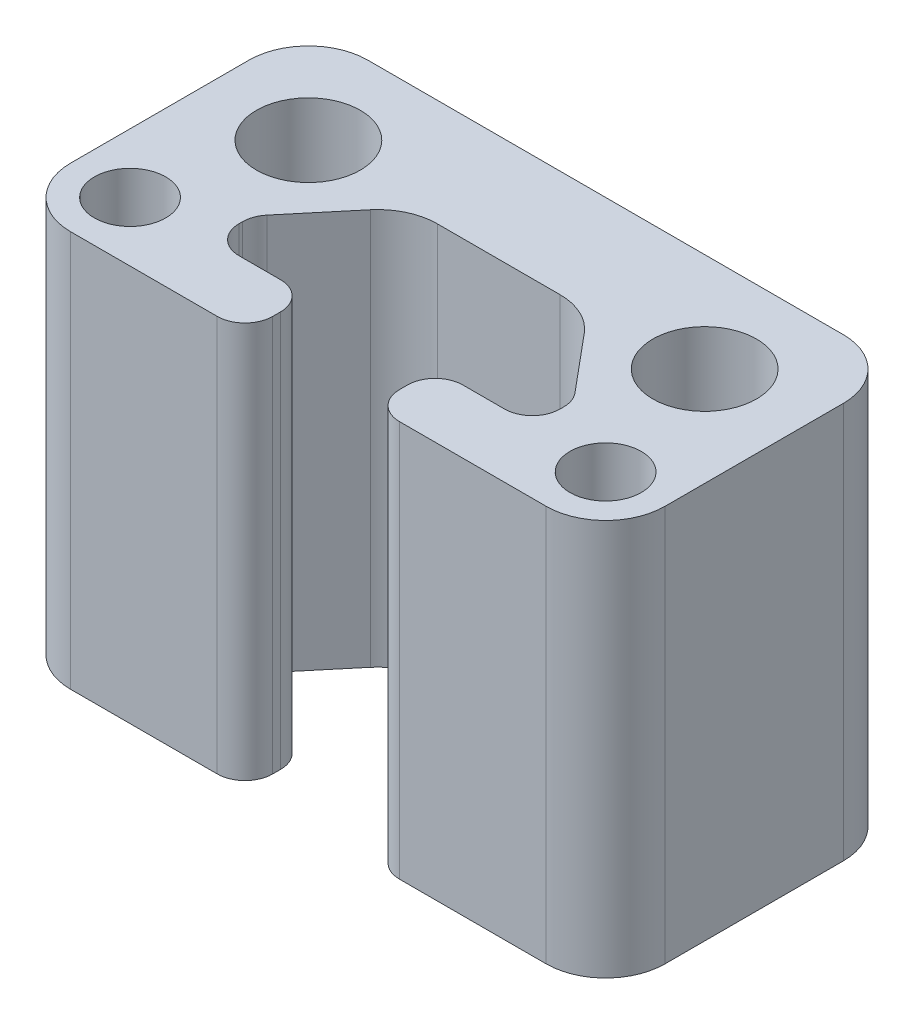
ISO-10303-21;
HEADER;
FILE_DESCRIPTION(('STEP AP214'),'2;1');
FILE_NAME('part.step','',(''),(''),'','','');
FILE_SCHEMA(('AUTOMOTIVE_DESIGN { 1 0 10303 214 1 1 1 1 }'));
ENDSEC;
DATA;
#1=APPLICATION_CONTEXT('core data for automotive mechanical design processes');
#2=APPLICATION_PROTOCOL_DEFINITION('international standard','automotive_design',2000,#1);
#3=PRODUCT_CONTEXT('',#1,'mechanical');
#4=PRODUCT('Part','Part','',(#3));
#5=PRODUCT_RELATED_PRODUCT_CATEGORY('part','',(#4));
#6=PRODUCT_DEFINITION_FORMATION('','',#4);
#7=PRODUCT_DEFINITION_CONTEXT('part definition',#1,'design');
#8=PRODUCT_DEFINITION('design','',#6,#7);
#9=PRODUCT_DEFINITION_SHAPE('','',#8);
#10=(LENGTH_UNIT() NAMED_UNIT(*) SI_UNIT(.MILLI.,.METRE.));
#11=(NAMED_UNIT(*) PLANE_ANGLE_UNIT() SI_UNIT($,.RADIAN.));
#12=(NAMED_UNIT(*) SI_UNIT($,.STERADIAN.) SOLID_ANGLE_UNIT());
#13=UNCERTAINTY_MEASURE_WITH_UNIT(LENGTH_MEASURE(1.E-05),#10,'distance_accuracy_value','');
#14=(GEOMETRIC_REPRESENTATION_CONTEXT(3) GLOBAL_UNCERTAINTY_ASSIGNED_CONTEXT((#13)) GLOBAL_UNIT_ASSIGNED_CONTEXT((#10,
#11,#12)) REPRESENTATION_CONTEXT('',''));
#15=CARTESIAN_POINT('',(0.,0.,0.));
#16=DIRECTION('',(0.,0.,1.));
#17=DIRECTION('',(1.,0.,0.));
#18=AXIS2_PLACEMENT_3D('',#15,#16,#17);
#19=CARTESIAN_POINT('',(34.036,-0.508,131.631514102536));
#20=DIRECTION('',(1.,0.,0.));
#21=DIRECTION('',(0.,0.,-1.));
#22=AXIS2_PLACEMENT_3D('',#19,#20,#21);
#23=PLANE('',#22);
#24=DIRECTION('',(0.,1.,0.));
#25=VECTOR('',#24,1.);
#26=CARTESIAN_POINT('',(34.036,12.7,131.064));
#27=LINE('',#26,#25);
#28=CARTESIAN_POINT('',(34.036,0.,131.064));
#29=VERTEX_POINT('',#28);
#30=CARTESIAN_POINT('',(34.036,25.4,131.064));
#31=VERTEX_POINT('',#30);
#32=EDGE_CURVE('E295',#29,#31,#27,.T.);
#33=ORIENTED_EDGE('',*,*,#32,.T.);
#34=DIRECTION('',(0.,0.,-1.));
#35=VECTOR('',#34,1.);
#36=CARTESIAN_POINT('',(34.036,25.4,123.825));
#37=LINE('',#36,#35);
#38=CARTESIAN_POINT('',(34.036,25.4,131.572));
#39=VERTEX_POINT('',#38);
#40=EDGE_CURVE('E316',#31,#39,#37,.F.);
#41=ORIENTED_EDGE('',*,*,#40,.T.);
#42=DIRECTION('',(0.,-1.,0.));
#43=VECTOR('',#42,1.);
#44=CARTESIAN_POINT('',(34.036,12.7,131.572));
#45=LINE('',#44,#43);
#46=CARTESIAN_POINT('',(34.036,0.,131.572));
#47=VERTEX_POINT('',#46);
#48=EDGE_CURVE('E299',#39,#47,#45,.T.);
#49=ORIENTED_EDGE('',*,*,#48,.T.);
#50=DIRECTION('',(0.,0.,-1.));
#51=VECTOR('',#50,1.);
#52=CARTESIAN_POINT('',(34.036,0.,131.318));
#53=LINE('',#52,#51);
#54=EDGE_CURVE('E453',#29,#47,#53,.F.);
#55=ORIENTED_EDGE('',*,*,#54,.F.);
#56=EDGE_LOOP('',(#33,#41,#49,#55));
#57=FACE_BOUND('',#56,.T.);
#58=ADVANCED_FACE('F17',(#57),#23,.T.);
#59=CARTESIAN_POINT('',(27.813,-0.508,127.567514102536));
#60=DIRECTION('',(1.,0.,0.));
#61=DIRECTION('',(0.,0.,-1.));
#62=AXIS2_PLACEMENT_3D('',#59,#60,#61);
#63=PLANE('',#62);
#64=DIRECTION('',(0.,-1.,0.));
#65=VECTOR('',#64,1.);
#66=CARTESIAN_POINT('',(27.8130000000044,12.7,127.278125725383));
#67=LINE('',#66,#65);
#68=CARTESIAN_POINT('',(27.8130000000022,0.,127.278125725383));
#69=VERTEX_POINT('',#68);
#70=CARTESIAN_POINT('',(27.8130000000022,25.4,127.278125725383));
#71=VERTEX_POINT('',#70);
#72=EDGE_CURVE('E206',#69,#71,#67,.F.);
#73=ORIENTED_EDGE('',*,*,#72,.T.);
#74=DIRECTION('',(0.,0.,-1.));
#75=VECTOR('',#74,1.);
#76=CARTESIAN_POINT('',(27.813,25.4,123.825));
#77=LINE('',#76,#75);
#78=CARTESIAN_POINT('',(27.813,25.4,127.508));
#79=VERTEX_POINT('',#78);
#80=EDGE_CURVE('E319',#71,#79,#77,.F.);
#81=ORIENTED_EDGE('',*,*,#80,.T.);
#82=DIRECTION('',(0.,1.,0.));
#83=VECTOR('',#82,1.);
#84=CARTESIAN_POINT('',(27.813,12.7,127.508));
#85=LINE('',#84,#83);
#86=CARTESIAN_POINT('',(27.813,0.,127.508));
#87=VERTEX_POINT('',#86);
#88=EDGE_CURVE('E406',#79,#87,#85,.F.);
#89=ORIENTED_EDGE('',*,*,#88,.T.);
#90=DIRECTION('',(0.,0.,-1.));
#91=VECTOR('',#90,1.);
#92=CARTESIAN_POINT('',(27.813,0.,127.393062862692));
#93=LINE('',#92,#91);
#94=EDGE_CURVE('E209',#69,#87,#93,.F.);
#95=ORIENTED_EDGE('',*,*,#94,.F.);
#96=EDGE_LOOP('',(#73,#81,#89,#95));
#97=FACE_BOUND('',#96,.T.);
#98=ADVANCED_FACE('F517',(#97),#63,.T.);
#99=CARTESIAN_POINT('',(29.591,0.,127.278125725383));
#100=DIRECTION('',(0.,1.,0.));
#101=DIRECTION('',(0.,0.,1.));
#102=AXIS2_PLACEMENT_3D('',#99,#100,#101);
#103=CYLINDRICAL_SURFACE('',#102,1.77799999999561);
#104=ORIENTED_EDGE('',*,*,#72,.F.);
#105=CARTESIAN_POINT('',(29.591,0.,127.278125725383));
#106=DIRECTION('',(0.,1.,0.));
#107=DIRECTION('',(0.,0.,1.));
#108=AXIS2_PLACEMENT_3D('',#105,#106,#107);
#109=CIRCLE('',#108,1.77799999999561);
#110=CARTESIAN_POINT('',(28.2262260120897,0.,126.138531077296));
#111=VERTEX_POINT('',#110);
#112=EDGE_CURVE('E21',#111,#69,#109,.T.);
#113=ORIENTED_EDGE('',*,*,#112,.F.);
#114=DIRECTION('',(0.,-1.,0.));
#115=VECTOR('',#114,1.);
#116=CARTESIAN_POINT('',(28.2262260120948,12.7,126.13853107729));
#117=LINE('',#116,#115);
#118=CARTESIAN_POINT('',(28.2262260120897,25.4,126.138531077296));
#119=VERTEX_POINT('',#118);
#120=EDGE_CURVE('E205',#111,#119,#117,.F.);
#121=ORIENTED_EDGE('',*,*,#120,.T.);
#122=CARTESIAN_POINT('',(29.591,25.4,127.278125725383));
#123=DIRECTION('',(0.,1.,0.));
#124=DIRECTION('',(0.,0.,1.));
#125=AXIS2_PLACEMENT_3D('',#122,#123,#124);
#126=CIRCLE('',#125,1.77799999999561);
#127=EDGE_CURVE('E317',#119,#71,#126,.T.);
#128=ORIENTED_EDGE('',*,*,#127,.T.);
#129=EDGE_LOOP('',(#104,#113,#121,#128));
#130=FACE_BOUND('',#129,.T.);
#131=ADVANCED_FACE('F203',(#130),#103,.F.);
#132=CARTESIAN_POINT('',(46.609,0.,127.278125725383));
#133=DIRECTION('',(0.,1.,0.));
#134=DIRECTION('',(0.,0.,1.));
#135=AXIS2_PLACEMENT_3D('',#132,#133,#134);
#136=CYLINDRICAL_SURFACE('',#135,1.778);
#137=DIRECTION('',(0.,1.,0.));
#138=VECTOR('',#137,1.);
#139=CARTESIAN_POINT('',(47.9737739879052,12.7,126.13853107729));
#140=LINE('',#139,#138);
#141=CARTESIAN_POINT('',(47.9737739879103,25.4,126.138531077296));
#142=VERTEX_POINT('',#141);
#143=CARTESIAN_POINT('',(47.9737739879103,0.,126.138531077296));
#144=VERTEX_POINT('',#143);
#145=EDGE_CURVE('E397',#142,#144,#140,.F.);
#146=ORIENTED_EDGE('',*,*,#145,.T.);
#147=CARTESIAN_POINT('',(46.609,0.,127.278125725383));
#148=DIRECTION('',(0.,1.,0.));
#149=DIRECTION('',(0.,0.,1.));
#150=AXIS2_PLACEMENT_3D('',#147,#148,#149);
#151=CIRCLE('',#150,1.778);
#152=CARTESIAN_POINT('',(48.387,0.,127.278125725383));
#153=VERTEX_POINT('',#152);
#154=EDGE_CURVE('E322',#153,#144,#151,.T.);
#155=ORIENTED_EDGE('',*,*,#154,.F.);
#156=DIRECTION('',(0.,-1.,0.));
#157=VECTOR('',#156,1.);
#158=CARTESIAN_POINT('',(48.387,12.7,127.278125725383));
#159=LINE('',#158,#157);
#160=CARTESIAN_POINT('',(48.387,25.4,127.278125725383));
#161=VERTEX_POINT('',#160);
#162=EDGE_CURVE('E327',#153,#161,#159,.F.);
#163=ORIENTED_EDGE('',*,*,#162,.T.);
#164=CARTESIAN_POINT('',(46.609,25.4,127.278125725383));
#165=DIRECTION('',(0.,1.,0.));
#166=DIRECTION('',(0.,0.,1.));
#167=AXIS2_PLACEMENT_3D('',#164,#165,#166);
#168=CIRCLE('',#167,1.778);
#169=EDGE_CURVE('E320',#161,#142,#168,.T.);
#170=ORIENTED_EDGE('',*,*,#169,.T.);
#171=EDGE_LOOP('',(#146,#155,#163,#170));
#172=FACE_BOUND('',#171,.T.);
#173=ADVANCED_FACE('F504',(#172),#136,.F.);
#174=CARTESIAN_POINT('',(48.387,-0.508,127.218611622847));
#175=DIRECTION('',(-1.,0.,0.));
#176=DIRECTION('',(0.,0.,1.));
#177=AXIS2_PLACEMENT_3D('',#174,#175,#176);
#178=PLANE('',#177);
#179=ORIENTED_EDGE('',*,*,#162,.F.);
#180=DIRECTION('',(0.,0.,1.));
#181=VECTOR('',#180,1.);
#182=CARTESIAN_POINT('',(48.387,0.,127.393062862692));
#183=LINE('',#182,#181);
#184=CARTESIAN_POINT('',(48.387,0.,127.508));
#185=VERTEX_POINT('',#184);
#186=EDGE_CURVE('E323',#185,#153,#183,.F.);
#187=ORIENTED_EDGE('',*,*,#186,.F.);
#188=DIRECTION('',(0.,-1.,0.));
#189=VECTOR('',#188,1.);
#190=CARTESIAN_POINT('',(48.387,12.7,127.508));
#191=LINE('',#190,#189);
#192=CARTESIAN_POINT('',(48.387,25.4,127.508));
#193=VERTEX_POINT('',#192);
#194=EDGE_CURVE('E280',#185,#193,#191,.F.);
#195=ORIENTED_EDGE('',*,*,#194,.T.);
#196=DIRECTION('',(0.,0.,1.));
#197=VECTOR('',#196,1.);
#198=CARTESIAN_POINT('',(48.387,25.4,123.825));
#199=LINE('',#198,#197);
#200=EDGE_CURVE('E321',#193,#161,#199,.F.);
#201=ORIENTED_EDGE('',*,*,#200,.T.);
#202=EDGE_LOOP('',(#179,#187,#195,#201));
#203=FACE_BOUND('',#202,.T.);
#204=ADVANCED_FACE('F501',(#203),#178,.T.);
#205=CARTESIAN_POINT('',(42.164,-0.508,131.004485897464));
#206=DIRECTION('',(-1.,0.,0.));
#207=DIRECTION('',(0.,0.,1.));
#208=AXIS2_PLACEMENT_3D('',#205,#206,#207);
#209=PLANE('',#208);
#210=DIRECTION('',(0.,-1.,0.));
#211=VECTOR('',#210,1.);
#212=CARTESIAN_POINT('',(42.164,12.7,131.064));
#213=LINE('',#212,#211);
#214=CARTESIAN_POINT('',(42.164,25.4,131.064));
#215=VERTEX_POINT('',#214);
#216=CARTESIAN_POINT('',(42.164,0.,131.064));
#217=VERTEX_POINT('',#216);
#218=EDGE_CURVE('E275',#215,#217,#213,.T.);
#219=ORIENTED_EDGE('',*,*,#218,.T.);
#220=DIRECTION('',(0.,0.,1.));
#221=VECTOR('',#220,1.);
#222=CARTESIAN_POINT('',(42.164,0.,131.318));
#223=LINE('',#222,#221);
#224=CARTESIAN_POINT('',(42.164,0.,131.572));
#225=VERTEX_POINT('',#224);
#226=EDGE_CURVE('E338',#225,#217,#223,.F.);
#227=ORIENTED_EDGE('',*,*,#226,.F.);
#228=DIRECTION('',(0.,1.,0.));
#229=VECTOR('',#228,1.);
#230=CARTESIAN_POINT('',(42.164,12.7,131.572));
#231=LINE('',#230,#229);
#232=CARTESIAN_POINT('',(42.164,25.4,131.572));
#233=VERTEX_POINT('',#232);
#234=EDGE_CURVE('E271',#225,#233,#231,.T.);
#235=ORIENTED_EDGE('',*,*,#234,.T.);
#236=DIRECTION('',(0.,0.,1.));
#237=VECTOR('',#236,1.);
#238=CARTESIAN_POINT('',(42.164,25.4,123.825));
#239=LINE('',#238,#237);
#240=EDGE_CURVE('E441',#233,#215,#239,.F.);
#241=ORIENTED_EDGE('',*,*,#240,.T.);
#242=EDGE_LOOP('',(#219,#227,#235,#241));
#243=FACE_BOUND('',#242,.T.);
#244=ADVANCED_FACE('F485',(#243),#209,.T.);
#245=CARTESIAN_POINT('',(57.912,25.4,113.919));
#246=DIRECTION('',(0.,1.,0.));
#247=DIRECTION('',(-1.,0.,0.));
#248=AXIS2_PLACEMENT_3D('',#245,#246,#247);
#249=PLANE('',#248);
#250=CARTESIAN_POINT('',(53.34,25.4,129.54));
#251=DIRECTION('',(0.,1.,0.));
#252=DIRECTION('',(0.,0.,1.));
#253=AXIS2_PLACEMENT_3D('',#250,#251,#252);
#254=CIRCLE('',#253,2.286);
#255=CARTESIAN_POINT('',(53.34,25.4,131.826));
#256=VERTEX_POINT('',#255);
#257=EDGE_CURVE('E255',#256,#256,#254,.F.);
#258=ORIENTED_EDGE('',*,*,#257,.T.);
#259=EDGE_LOOP('',(#258));
#260=FACE_BOUND('',#259,.T.);
#261=CARTESIAN_POINT('',(22.86,25.4,129.54));
#262=DIRECTION('',(0.,1.,0.));
#263=DIRECTION('',(0.,0.,1.));
#264=AXIS2_PLACEMENT_3D('',#261,#262,#263);
#265=CIRCLE('',#264,2.286);
#266=CARTESIAN_POINT('',(22.86,25.4,131.826));
#267=VERTEX_POINT('',#266);
#268=EDGE_CURVE('E258',#267,#267,#265,.F.);
#269=ORIENTED_EDGE('',*,*,#268,.T.);
#270=EDGE_LOOP('',(#269));
#271=FACE_BOUND('',#270,.T.);
#272=CARTESIAN_POINT('',(50.8,25.4,120.65));
#273=DIRECTION('',(0.,1.,0.));
#274=DIRECTION('',(0.,0.,1.));
#275=AXIS2_PLACEMENT_3D('',#272,#273,#274);
#276=CIRCLE('',#275,3.3274);
#277=CARTESIAN_POINT('',(50.8,25.4,123.9774));
#278=VERTEX_POINT('',#277);
#279=EDGE_CURVE('E261',#278,#278,#276,.F.);
#280=ORIENTED_EDGE('',*,*,#279,.T.);
#281=EDGE_LOOP('',(#280));
#282=FACE_BOUND('',#281,.T.);
#283=CARTESIAN_POINT('',(25.4,25.4,120.65));
#284=DIRECTION('',(0.,1.,0.));
#285=DIRECTION('',(0.,0.,1.));
#286=AXIS2_PLACEMENT_3D('',#283,#284,#285);
#287=CIRCLE('',#286,3.3274);
#288=CARTESIAN_POINT('',(25.4,25.4,123.9774));
#289=VERTEX_POINT('',#288);
#290=EDGE_CURVE('E264',#289,#289,#287,.F.);
#291=ORIENTED_EDGE('',*,*,#290,.T.);
#292=EDGE_LOOP('',(#291));
#293=FACE_BOUND('',#292,.T.);
#294=CARTESIAN_POINT('',(53.34,25.4,118.11));
#295=DIRECTION('',(0.,-1.,0.));
#296=DIRECTION('',(0.,0.,-1.));
#297=AXIS2_PLACEMENT_3D('',#294,#295,#296);
#298=CIRCLE('',#297,3.80999999999998);
#299=CARTESIAN_POINT('',(57.15,25.4,118.11));
#300=VERTEX_POINT('',#299);
#301=CARTESIAN_POINT('',(53.34,25.4,114.3));
#302=VERTEX_POINT('',#301);
#303=EDGE_CURVE('E309',#300,#302,#298,.F.);
#304=ORIENTED_EDGE('',*,*,#303,.T.);
#305=DIRECTION('',(1.,0.,0.));
#306=VECTOR('',#305,1.);
#307=CARTESIAN_POINT('',(38.1,25.4,114.3));
#308=LINE('',#307,#306);
#309=CARTESIAN_POINT('',(22.86,25.4,114.3));
#310=VERTEX_POINT('',#309);
#311=EDGE_CURVE('E430',#302,#310,#308,.F.);
#312=ORIENTED_EDGE('',*,*,#311,.T.);
#313=CARTESIAN_POINT('',(22.86,25.4,118.11));
#314=DIRECTION('',(0.,-1.,0.));
#315=DIRECTION('',(0.,0.,-1.));
#316=AXIS2_PLACEMENT_3D('',#313,#314,#315);
#317=CIRCLE('',#316,3.81);
#318=CARTESIAN_POINT('',(19.05,25.4,118.11));
#319=VERTEX_POINT('',#318);
#320=EDGE_CURVE('E305',#310,#319,#317,.F.);
#321=ORIENTED_EDGE('',*,*,#320,.T.);
#322=DIRECTION('',(0.,0.,-1.));
#323=VECTOR('',#322,1.);
#324=CARTESIAN_POINT('',(19.05,25.4,123.825));
#325=LINE('',#324,#323);
#326=CARTESIAN_POINT('',(19.05,25.4,129.54));
#327=VERTEX_POINT('',#326);
#328=EDGE_CURVE('E425',#319,#327,#325,.F.);
#329=ORIENTED_EDGE('',*,*,#328,.T.);
#330=CARTESIAN_POINT('',(22.86,25.4,129.54));
#331=DIRECTION('',(0.,-1.,0.));
#332=DIRECTION('',(0.,0.,-1.));
#333=AXIS2_PLACEMENT_3D('',#330,#331,#332);
#334=CIRCLE('',#333,3.81000000000001);
#335=CARTESIAN_POINT('',(22.86,25.4,133.35));
#336=VERTEX_POINT('',#335);
#337=EDGE_CURVE('E301',#327,#336,#334,.F.);
#338=ORIENTED_EDGE('',*,*,#337,.T.);
#339=DIRECTION('',(-1.,0.,0.));
#340=VECTOR('',#339,1.);
#341=CARTESIAN_POINT('',(27.559,25.4,133.35));
#342=LINE('',#341,#340);
#343=CARTESIAN_POINT('',(32.258,25.4,133.35));
#344=VERTEX_POINT('',#343);
#345=EDGE_CURVE('E420',#336,#344,#342,.F.);
#346=ORIENTED_EDGE('',*,*,#345,.T.);
#347=CARTESIAN_POINT('',(32.258,25.4,131.572));
#348=DIRECTION('',(0.,-1.,0.));
#349=DIRECTION('',(0.,0.,-1.));
#350=AXIS2_PLACEMENT_3D('',#347,#348,#349);
#351=CIRCLE('',#350,1.778);
#352=EDGE_CURVE('E296',#344,#39,#351,.F.);
#353=ORIENTED_EDGE('',*,*,#352,.T.);
#354=ORIENTED_EDGE('',*,*,#40,.F.);
#355=CARTESIAN_POINT('',(32.258,25.4,131.064));
#356=DIRECTION('',(0.,-1.,0.));
#357=DIRECTION('',(0.,0.,-1.));
#358=AXIS2_PLACEMENT_3D('',#355,#356,#357);
#359=CIRCLE('',#358,1.77799999999997);
#360=CARTESIAN_POINT('',(32.258,25.4,129.286));
#361=VERTEX_POINT('',#360);
#362=EDGE_CURVE('E292',#31,#361,#359,.F.);
#363=ORIENTED_EDGE('',*,*,#362,.T.);
#364=DIRECTION('',(1.,0.,0.));
#365=VECTOR('',#364,1.);
#366=CARTESIAN_POINT('',(30.9245,25.4,129.286));
#367=LINE('',#366,#365);
#368=CARTESIAN_POINT('',(29.591,25.4,129.286));
#369=VERTEX_POINT('',#368);
#370=EDGE_CURVE('E409',#361,#369,#367,.F.);
#371=ORIENTED_EDGE('',*,*,#370,.T.);
#372=CARTESIAN_POINT('',(29.591,25.4,127.508));
#373=DIRECTION('',(0.,1.,0.));
#374=DIRECTION('',(0.,0.,1.));
#375=AXIS2_PLACEMENT_3D('',#372,#373,#374);
#376=CIRCLE('',#375,1.778);
#377=EDGE_CURVE('E217',#369,#79,#376,.F.);
#378=ORIENTED_EDGE('',*,*,#377,.T.);
#379=ORIENTED_EDGE('',*,*,#80,.F.);
#380=ORIENTED_EDGE('',*,*,#127,.F.);
#381=DIRECTION('',(-0.640941871808921,0.,0.767589419521971));
#382=VECTOR('',#381,1.);
#383=CARTESIAN_POINT('',(29.734464023968,25.4,124.332271272844));
#384=LINE('',#383,#382);
#385=CARTESIAN_POINT('',(31.242702035851,25.4,122.526011468397));
#386=VERTEX_POINT('',#385);
#387=EDGE_CURVE('E216',#119,#386,#384,.F.);
#388=ORIENTED_EDGE('',*,*,#387,.T.);
#389=CARTESIAN_POINT('',(34.167217724229,25.4,124.968));
#390=DIRECTION('',(0.,1.,0.));
#391=DIRECTION('',(0.,0.,1.));
#392=AXIS2_PLACEMENT_3D('',#389,#390,#391);
#393=CIRCLE('',#392,3.80999999999999);
#394=CARTESIAN_POINT('',(34.167217724229,25.4,121.158));
#395=VERTEX_POINT('',#394);
#396=EDGE_CURVE('E285',#386,#395,#393,.F.);
#397=ORIENTED_EDGE('',*,*,#396,.T.);
#398=DIRECTION('',(-1.,0.,0.));
#399=VECTOR('',#398,1.);
#400=CARTESIAN_POINT('',(38.1,25.4,121.158));
#401=LINE('',#400,#399);
#402=CARTESIAN_POINT('',(42.032782275771,25.4,121.157999999998));
#403=VERTEX_POINT('',#402);
#404=EDGE_CURVE('E402',#395,#403,#401,.F.);
#405=ORIENTED_EDGE('',*,*,#404,.T.);
#406=CARTESIAN_POINT('',(42.032782275771,25.4,124.968));
#407=DIRECTION('',(0.,1.,0.));
#408=DIRECTION('',(0.,0.,1.));
#409=AXIS2_PLACEMENT_3D('',#406,#407,#408);
#410=CIRCLE('',#409,3.81000000000503);
#411=CARTESIAN_POINT('',(44.9572979641541,25.4,122.526011468393));
#412=VERTEX_POINT('',#411);
#413=EDGE_CURVE('E281',#403,#412,#410,.F.);
#414=ORIENTED_EDGE('',*,*,#413,.T.);
#415=DIRECTION('',(-0.640941871808922,0.,-0.76758941952197));
#416=VECTOR('',#415,1.);
#417=CARTESIAN_POINT('',(46.465535976032,25.4,124.332271272844));
#418=LINE('',#417,#416);
#419=EDGE_CURVE('E399',#412,#142,#418,.F.);
#420=ORIENTED_EDGE('',*,*,#419,.T.);
#421=ORIENTED_EDGE('',*,*,#169,.F.);
#422=ORIENTED_EDGE('',*,*,#200,.F.);
#423=CARTESIAN_POINT('',(46.609,25.4,127.508));
#424=DIRECTION('',(0.,1.,0.));
#425=DIRECTION('',(0.,0.,1.));
#426=AXIS2_PLACEMENT_3D('',#423,#424,#425);
#427=CIRCLE('',#426,1.77799999999999);
#428=CARTESIAN_POINT('',(46.609,25.4,129.286));
#429=VERTEX_POINT('',#428);
#430=EDGE_CURVE('E277',#193,#429,#427,.F.);
#431=ORIENTED_EDGE('',*,*,#430,.T.);
#432=DIRECTION('',(1.,0.,0.));
#433=VECTOR('',#432,1.);
#434=CARTESIAN_POINT('',(45.2755,25.4,129.286));
#435=LINE('',#434,#433);
#436=CARTESIAN_POINT('',(43.942,25.4,129.286));
#437=VERTEX_POINT('',#436);
#438=EDGE_CURVE('E392',#429,#437,#435,.F.);
#439=ORIENTED_EDGE('',*,*,#438,.T.);
#440=CARTESIAN_POINT('',(43.942,25.4,131.064));
#441=DIRECTION('',(0.,-1.,0.));
#442=DIRECTION('',(0.,0.,-1.));
#443=AXIS2_PLACEMENT_3D('',#440,#441,#442);
#444=CIRCLE('',#443,1.77799999999999);
#445=EDGE_CURVE('E272',#437,#215,#444,.F.);
#446=ORIENTED_EDGE('',*,*,#445,.T.);
#447=ORIENTED_EDGE('',*,*,#240,.F.);
#448=CARTESIAN_POINT('',(43.942,25.4,131.572));
#449=DIRECTION('',(0.,-1.,0.));
#450=DIRECTION('',(0.,0.,-1.));
#451=AXIS2_PLACEMENT_3D('',#448,#449,#450);
#452=CIRCLE('',#451,1.77800000000003);
#453=CARTESIAN_POINT('',(43.942,25.4,133.35));
#454=VERTEX_POINT('',#453);
#455=EDGE_CURVE('E268',#233,#454,#452,.F.);
#456=ORIENTED_EDGE('',*,*,#455,.T.);
#457=DIRECTION('',(-1.,0.,0.));
#458=VECTOR('',#457,1.);
#459=CARTESIAN_POINT('',(48.641,25.4,133.35));
#460=LINE('',#459,#458);
#461=CARTESIAN_POINT('',(53.34,25.4,133.35));
#462=VERTEX_POINT('',#461);
#463=EDGE_CURVE('E267',#454,#462,#460,.F.);
#464=ORIENTED_EDGE('',*,*,#463,.T.);
#465=CARTESIAN_POINT('',(53.34,25.4,129.54));
#466=DIRECTION('',(0.,-1.,0.));
#467=DIRECTION('',(0.,0.,-1.));
#468=AXIS2_PLACEMENT_3D('',#465,#466,#467);
#469=CIRCLE('',#468,3.81);
#470=CARTESIAN_POINT('',(57.15,25.4,129.54));
#471=VERTEX_POINT('',#470);
#472=EDGE_CURVE('E313',#462,#471,#469,.F.);
#473=ORIENTED_EDGE('',*,*,#472,.T.);
#474=DIRECTION('',(0.,0.,1.));
#475=VECTOR('',#474,1.);
#476=CARTESIAN_POINT('',(57.15,25.4,123.825));
#477=LINE('',#476,#475);
#478=EDGE_CURVE('E336',#471,#300,#477,.F.);
#479=ORIENTED_EDGE('',*,*,#478,.T.);
#480=EDGE_LOOP('',(#304,#312,#321,#329,#338,#346,#353,#354,#363,#371,#378,#379,#380,#388,#397,
#405,#414,#420,#421,#422,#431,#439,#446,#447,#456,#464,#473,#479));
#481=FACE_BOUND('',#480,.T.);
#482=ADVANCED_FACE('F459',(#260,#271,#282,#293,#481),#249,.T.);
#483=CARTESIAN_POINT('',(53.34,25.4,129.54));
#484=DIRECTION('',(0.,-1.,0.));
#485=DIRECTION('',(0.,0.,-1.));
#486=AXIS2_PLACEMENT_3D('',#483,#484,#485);
#487=CYLINDRICAL_SURFACE('',#486,3.81);
#488=ORIENTED_EDGE('',*,*,#472,.F.);
#489=DIRECTION('',(0.,1.,0.));
#490=VECTOR('',#489,1.);
#491=CARTESIAN_POINT('',(53.34,12.7,133.35));
#492=LINE('',#491,#490);
#493=CARTESIAN_POINT('',(53.34,0.,133.35));
#494=VERTEX_POINT('',#493);
#495=EDGE_CURVE('E270',#462,#494,#492,.F.);
#496=ORIENTED_EDGE('',*,*,#495,.T.);
#497=CARTESIAN_POINT('',(53.34,0.,129.54));
#498=DIRECTION('',(0.,-1.,0.));
#499=DIRECTION('',(0.,0.,-1.));
#500=AXIS2_PLACEMENT_3D('',#497,#498,#499);
#501=CIRCLE('',#500,3.81);
#502=CARTESIAN_POINT('',(57.15,0.,129.54));
#503=VERTEX_POINT('',#502);
#504=EDGE_CURVE('E252',#494,#503,#501,.F.);
#505=ORIENTED_EDGE('',*,*,#504,.T.);
#506=DIRECTION('',(0.,-1.,0.));
#507=VECTOR('',#506,1.);
#508=CARTESIAN_POINT('',(57.15,12.7,129.54));
#509=LINE('',#508,#507);
#510=EDGE_CURVE('E315',#503,#471,#509,.F.);
#511=ORIENTED_EDGE('',*,*,#510,.T.);
#512=EDGE_LOOP('',(#488,#496,#505,#511));
#513=FACE_BOUND('',#512,.T.);
#514=ADVANCED_FACE('F477',(#513),#487,.T.);
#515=CARTESIAN_POINT('',(57.15,-0.508,129.7686));
#516=DIRECTION('',(1.,0.,0.));
#517=DIRECTION('',(0.,0.,-1.));
#518=AXIS2_PLACEMENT_3D('',#515,#516,#517);
#519=PLANE('',#518);
#520=DIRECTION('',(0.,1.,0.));
#521=VECTOR('',#520,1.);
#522=CARTESIAN_POINT('',(57.15,12.7,118.11));
#523=LINE('',#522,#521);
#524=CARTESIAN_POINT('',(57.15,0.,118.11));
#525=VERTEX_POINT('',#524);
#526=EDGE_CURVE('E312',#525,#300,#523,.T.);
#527=ORIENTED_EDGE('',*,*,#526,.T.);
#528=ORIENTED_EDGE('',*,*,#478,.F.);
#529=ORIENTED_EDGE('',*,*,#510,.F.);
#530=DIRECTION('',(0.,0.,-1.));
#531=VECTOR('',#530,1.);
#532=CARTESIAN_POINT('',(57.15,0.,123.825));
#533=LINE('',#532,#531);
#534=EDGE_CURVE('E251',#503,#525,#533,.T.);
#535=ORIENTED_EDGE('',*,*,#534,.T.);
#536=EDGE_LOOP('',(#527,#528,#529,#535));
#537=FACE_BOUND('',#536,.T.);
#538=ADVANCED_FACE('F475',(#537),#519,.T.);
#539=CARTESIAN_POINT('',(53.34,25.4,118.11));
#540=DIRECTION('',(0.,-1.,0.));
#541=DIRECTION('',(0.,0.,-1.));
#542=AXIS2_PLACEMENT_3D('',#539,#540,#541);
#543=CYLINDRICAL_SURFACE('',#542,3.80999999999998);
#544=ORIENTED_EDGE('',*,*,#303,.F.);
#545=ORIENTED_EDGE('',*,*,#526,.F.);
#546=CARTESIAN_POINT('',(53.34,0.,118.11));
#547=DIRECTION('',(0.,-1.,0.));
#548=DIRECTION('',(0.,0.,-1.));
#549=AXIS2_PLACEMENT_3D('',#546,#547,#548);
#550=CIRCLE('',#549,3.80999999999998);
#551=CARTESIAN_POINT('',(53.34,0.,114.3));
#552=VERTEX_POINT('',#551);
#553=EDGE_CURVE('E248',#525,#552,#550,.F.);
#554=ORIENTED_EDGE('',*,*,#553,.T.);
#555=DIRECTION('',(0.,-1.,0.));
#556=VECTOR('',#555,1.);
#557=CARTESIAN_POINT('',(53.34,12.7,114.3));
#558=LINE('',#557,#556);
#559=EDGE_CURVE('E311',#552,#302,#558,.F.);
#560=ORIENTED_EDGE('',*,*,#559,.T.);
#561=EDGE_LOOP('',(#544,#545,#554,#560));
#562=FACE_BOUND('',#561,.T.);
#563=ADVANCED_FACE('F472',(#562),#543,.T.);
#564=CARTESIAN_POINT('',(53.9496,-0.508,114.3));
#565=DIRECTION('',(0.,0.,-1.));
#566=DIRECTION('',(-1.,0.,0.));
#567=AXIS2_PLACEMENT_3D('',#564,#565,#566);
#568=PLANE('',#567);
#569=ORIENTED_EDGE('',*,*,#559,.F.);
#570=DIRECTION('',(-1.,0.,0.));
#571=VECTOR('',#570,1.);
#572=CARTESIAN_POINT('',(38.1,0.,114.3));
#573=LINE('',#572,#571);
#574=CARTESIAN_POINT('',(22.86,0.,114.3));
#575=VERTEX_POINT('',#574);
#576=EDGE_CURVE('E247',#552,#575,#573,.T.);
#577=ORIENTED_EDGE('',*,*,#576,.T.);
#578=DIRECTION('',(0.,1.,0.));
#579=VECTOR('',#578,1.);
#580=CARTESIAN_POINT('',(22.86,12.7,114.3));
#581=LINE('',#580,#579);
#582=EDGE_CURVE('E308',#575,#310,#581,.T.);
#583=ORIENTED_EDGE('',*,*,#582,.T.);
#584=ORIENTED_EDGE('',*,*,#311,.F.);
#585=EDGE_LOOP('',(#569,#577,#583,#584));
#586=FACE_BOUND('',#585,.T.);
#587=ADVANCED_FACE('F466',(#586),#568,.T.);
#588=CARTESIAN_POINT('',(22.86,25.4,118.11));
#589=DIRECTION('',(0.,-1.,0.));
#590=DIRECTION('',(0.,0.,-1.));
#591=AXIS2_PLACEMENT_3D('',#588,#589,#590);
#592=CYLINDRICAL_SURFACE('',#591,3.81);
#593=ORIENTED_EDGE('',*,*,#320,.F.);
#594=ORIENTED_EDGE('',*,*,#582,.F.);
#595=CARTESIAN_POINT('',(22.86,0.,118.11));
#596=DIRECTION('',(0.,-1.,0.));
#597=DIRECTION('',(0.,0.,-1.));
#598=AXIS2_PLACEMENT_3D('',#595,#596,#597);
#599=CIRCLE('',#598,3.81);
#600=CARTESIAN_POINT('',(19.05,0.,118.11));
#601=VERTEX_POINT('',#600);
#602=EDGE_CURVE('E244',#575,#601,#599,.F.);
#603=ORIENTED_EDGE('',*,*,#602,.T.);
#604=DIRECTION('',(0.,-1.,0.));
#605=VECTOR('',#604,1.);
#606=CARTESIAN_POINT('',(19.05,12.7,118.11));
#607=LINE('',#606,#605);
#608=EDGE_CURVE('E307',#601,#319,#607,.F.);
#609=ORIENTED_EDGE('',*,*,#608,.T.);
#610=EDGE_LOOP('',(#593,#594,#603,#609));
#611=FACE_BOUND('',#610,.T.);
#612=ADVANCED_FACE('F464',(#611),#592,.T.);
#613=CARTESIAN_POINT('',(19.05,-0.508,117.8814));
#614=DIRECTION('',(-1.,0.,0.));
#615=DIRECTION('',(0.,0.,1.));
#616=AXIS2_PLACEMENT_3D('',#613,#614,#615);
#617=PLANE('',#616);
#618=ORIENTED_EDGE('',*,*,#608,.F.);
#619=DIRECTION('',(0.,0.,1.));
#620=VECTOR('',#619,1.);
#621=CARTESIAN_POINT('',(19.05,0.,123.825));
#622=LINE('',#621,#620);
#623=CARTESIAN_POINT('',(19.05,0.,129.54));
#624=VERTEX_POINT('',#623);
#625=EDGE_CURVE('E243',#601,#624,#622,.T.);
#626=ORIENTED_EDGE('',*,*,#625,.T.);
#627=DIRECTION('',(0.,1.,0.));
#628=VECTOR('',#627,1.);
#629=CARTESIAN_POINT('',(19.05,12.7,129.54));
#630=LINE('',#629,#628);
#631=EDGE_CURVE('E304',#624,#327,#630,.T.);
#632=ORIENTED_EDGE('',*,*,#631,.T.);
#633=ORIENTED_EDGE('',*,*,#328,.F.);
#634=EDGE_LOOP('',(#618,#626,#632,#633));
#635=FACE_BOUND('',#634,.T.);
#636=ADVANCED_FACE('F545',(#635),#617,.T.);
#637=CARTESIAN_POINT('',(22.86,25.4,129.54));
#638=DIRECTION('',(0.,-1.,0.));
#639=DIRECTION('',(0.,0.,-1.));
#640=AXIS2_PLACEMENT_3D('',#637,#638,#639);
#641=CYLINDRICAL_SURFACE('',#640,3.81000000000001);
#642=ORIENTED_EDGE('',*,*,#337,.F.);
#643=ORIENTED_EDGE('',*,*,#631,.F.);
#644=CARTESIAN_POINT('',(22.86,0.,129.54));
#645=DIRECTION('',(0.,-1.,0.));
#646=DIRECTION('',(0.,0.,-1.));
#647=AXIS2_PLACEMENT_3D('',#644,#645,#646);
#648=CIRCLE('',#647,3.81000000000001);
#649=CARTESIAN_POINT('',(22.86,0.,133.35));
#650=VERTEX_POINT('',#649);
#651=EDGE_CURVE('E240',#624,#650,#648,.F.);
#652=ORIENTED_EDGE('',*,*,#651,.T.);
#653=DIRECTION('',(0.,-1.,0.));
#654=VECTOR('',#653,1.);
#655=CARTESIAN_POINT('',(22.86,12.7,133.35));
#656=LINE('',#655,#654);
#657=EDGE_CURVE('E303',#650,#336,#656,.F.);
#658=ORIENTED_EDGE('',*,*,#657,.T.);
#659=EDGE_LOOP('',(#642,#643,#652,#658));
#660=FACE_BOUND('',#659,.T.);
#661=ADVANCED_FACE('F543',(#660),#641,.T.);
#662=CARTESIAN_POINT('',(22.67204,-0.508,133.35));
#663=DIRECTION('',(0.,0.,1.));
#664=DIRECTION('',(1.,0.,0.));
#665=AXIS2_PLACEMENT_3D('',#662,#663,#664);
#666=PLANE('',#665);
#667=DIRECTION('',(0.,1.,0.));
#668=VECTOR('',#667,1.);
#669=CARTESIAN_POINT('',(32.258,12.7,133.35));
#670=LINE('',#669,#668);
#671=CARTESIAN_POINT('',(32.258,0.,133.35));
#672=VERTEX_POINT('',#671);
#673=EDGE_CURVE('E300',#672,#344,#670,.T.);
#674=ORIENTED_EDGE('',*,*,#673,.T.);
#675=ORIENTED_EDGE('',*,*,#345,.F.);
#676=ORIENTED_EDGE('',*,*,#657,.F.);
#677=DIRECTION('',(1.,0.,0.));
#678=VECTOR('',#677,1.);
#679=CARTESIAN_POINT('',(38.1,0.,133.35));
#680=LINE('',#679,#678);
#681=EDGE_CURVE('E239',#650,#672,#680,.T.);
#682=ORIENTED_EDGE('',*,*,#681,.T.);
#683=EDGE_LOOP('',(#674,#675,#676,#682));
#684=FACE_BOUND('',#683,.T.);
#685=ADVANCED_FACE('F539',(#684),#666,.T.);
#686=CARTESIAN_POINT('',(32.258,25.4,131.572));
#687=DIRECTION('',(0.,-1.,0.));
#688=DIRECTION('',(0.,0.,-1.));
#689=AXIS2_PLACEMENT_3D('',#686,#687,#688);
#690=CYLINDRICAL_SURFACE('',#689,1.778);
#691=ORIENTED_EDGE('',*,*,#352,.F.);
#692=ORIENTED_EDGE('',*,*,#673,.F.);
#693=CARTESIAN_POINT('',(32.258,0.,131.572));
#694=DIRECTION('',(0.,-1.,0.));
#695=DIRECTION('',(0.,0.,-1.));
#696=AXIS2_PLACEMENT_3D('',#693,#694,#695);
#697=CIRCLE('',#696,1.778);
#698=EDGE_CURVE('E236',#672,#47,#697,.F.);
#699=ORIENTED_EDGE('',*,*,#698,.T.);
#700=ORIENTED_EDGE('',*,*,#48,.F.);
#701=EDGE_LOOP('',(#691,#692,#699,#700));
#702=FACE_BOUND('',#701,.T.);
#703=ADVANCED_FACE('F536',(#702),#690,.T.);
#704=CARTESIAN_POINT('',(32.258,25.4,131.064));
#705=DIRECTION('',(0.,-1.,0.));
#706=DIRECTION('',(0.,0.,-1.));
#707=AXIS2_PLACEMENT_3D('',#704,#705,#706);
#708=CYLINDRICAL_SURFACE('',#707,1.77799999999997);
#709=ORIENTED_EDGE('',*,*,#362,.F.);
#710=ORIENTED_EDGE('',*,*,#32,.F.);
#711=CARTESIAN_POINT('',(32.258,0.,131.064));
#712=DIRECTION('',(0.,-1.,0.));
#713=DIRECTION('',(0.,0.,-1.));
#714=AXIS2_PLACEMENT_3D('',#711,#712,#713);
#715=CIRCLE('',#714,1.77799999999997);
#716=CARTESIAN_POINT('',(32.258,0.,129.286));
#717=VERTEX_POINT('',#716);
#718=EDGE_CURVE('E233',#29,#717,#715,.F.);
#719=ORIENTED_EDGE('',*,*,#718,.T.);
#720=DIRECTION('',(0.,-1.,0.));
#721=VECTOR('',#720,1.);
#722=CARTESIAN_POINT('',(32.258,12.7,129.286));
#723=LINE('',#722,#721);
#724=EDGE_CURVE('E294',#717,#361,#723,.F.);
#725=ORIENTED_EDGE('',*,*,#724,.T.);
#726=EDGE_LOOP('',(#709,#710,#719,#725));
#727=FACE_BOUND('',#726,.T.);
#728=ADVANCED_FACE('F528',(#727),#708,.T.);
#729=CARTESIAN_POINT('',(32.3175141025362,-0.508,129.286));
#730=DIRECTION('',(0.,0.,-1.));
#731=DIRECTION('',(-1.,0.,0.));
#732=AXIS2_PLACEMENT_3D('',#729,#730,#731);
#733=PLANE('',#732);
#734=DIRECTION('',(0.,-1.,0.));
#735=VECTOR('',#734,1.);
#736=CARTESIAN_POINT('',(29.591,12.7,129.286));
#737=LINE('',#736,#735);
#738=CARTESIAN_POINT('',(29.591,0.,129.286));
#739=VERTEX_POINT('',#738);
#740=EDGE_CURVE('E291',#739,#369,#737,.F.);
#741=ORIENTED_EDGE('',*,*,#740,.T.);
#742=ORIENTED_EDGE('',*,*,#370,.F.);
#743=ORIENTED_EDGE('',*,*,#724,.F.);
#744=DIRECTION('',(-1.,0.,0.));
#745=VECTOR('',#744,1.);
#746=CARTESIAN_POINT('',(38.1,0.,129.286));
#747=LINE('',#746,#745);
#748=EDGE_CURVE('E229',#717,#739,#747,.T.);
#749=ORIENTED_EDGE('',*,*,#748,.T.);
#750=EDGE_LOOP('',(#741,#742,#743,#749));
#751=FACE_BOUND('',#750,.T.);
#752=ADVANCED_FACE('F524',(#751),#733,.T.);
#753=CARTESIAN_POINT('',(29.591,0.,127.508));
#754=DIRECTION('',(0.,1.,0.));
#755=DIRECTION('',(0.,0.,1.));
#756=AXIS2_PLACEMENT_3D('',#753,#754,#755);
#757=CYLINDRICAL_SURFACE('',#756,1.778);
#758=ORIENTED_EDGE('',*,*,#740,.F.);
#759=CARTESIAN_POINT('',(29.591,0.,127.508));
#760=DIRECTION('',(0.,1.,0.));
#761=DIRECTION('',(0.,0.,1.));
#762=AXIS2_PLACEMENT_3D('',#759,#760,#761);
#763=CIRCLE('',#762,1.778);
#764=EDGE_CURVE('E224',#739,#87,#763,.F.);
#765=ORIENTED_EDGE('',*,*,#764,.T.);
#766=ORIENTED_EDGE('',*,*,#88,.F.);
#767=ORIENTED_EDGE('',*,*,#377,.F.);
#768=EDGE_LOOP('',(#758,#765,#766,#767));
#769=FACE_BOUND('',#768,.T.);
#770=ADVANCED_FACE('F520',(#769),#757,.F.);
#771=CARTESIAN_POINT('',(28.1658964916148,-0.508,126.210781469474));
#772=DIRECTION('',(0.767589419521971,0.,0.640941871808921));
#773=DIRECTION('',(0.640941871808921,0.,-0.767589419521971));
#774=AXIS2_PLACEMENT_3D('',#771,#772,#773);
#775=PLANE('',#774);
#776=ORIENTED_EDGE('',*,*,#120,.F.);
#777=DIRECTION('',(0.640941871808921,0.,-0.767589419521971));
#778=VECTOR('',#777,1.);
#779=CARTESIAN_POINT('',(28.1658964916148,0.,126.210781469474));
#780=LINE('',#779,#778);
#781=CARTESIAN_POINT('',(31.242702035851,0.,122.526011468397));
#782=VERTEX_POINT('',#781);
#783=EDGE_CURVE('E215',#111,#782,#780,.T.);
#784=ORIENTED_EDGE('',*,*,#783,.T.);
#785=DIRECTION('',(0.,-1.,0.));
#786=VECTOR('',#785,1.);
#787=CARTESIAN_POINT('',(31.2427020358617,12.7,122.526011468394));
#788=LINE('',#787,#786);
#789=EDGE_CURVE('E288',#782,#386,#788,.F.);
#790=ORIENTED_EDGE('',*,*,#789,.T.);
#791=ORIENTED_EDGE('',*,*,#387,.F.);
#792=EDGE_LOOP('',(#776,#784,#790,#791));
#793=FACE_BOUND('',#792,.T.);
#794=ADVANCED_FACE('F213',(#793),#775,.T.);
#795=CARTESIAN_POINT('',(34.167217724229,0.,124.968));
#796=DIRECTION('',(0.,1.,0.));
#797=DIRECTION('',(0.,0.,1.));
#798=AXIS2_PLACEMENT_3D('',#795,#796,#797);
#799=CYLINDRICAL_SURFACE('',#798,3.80999999999999);
#800=ORIENTED_EDGE('',*,*,#789,.F.);
#801=CARTESIAN_POINT('',(34.167217724229,0.,124.968));
#802=DIRECTION('',(0.,1.,0.));
#803=DIRECTION('',(0.,0.,1.));
#804=AXIS2_PLACEMENT_3D('',#801,#802,#803);
#805=CIRCLE('',#804,3.80999999999999);
#806=CARTESIAN_POINT('',(34.167217724229,0.,121.158));
#807=VERTEX_POINT('',#806);
#808=EDGE_CURVE('E223',#782,#807,#805,.F.);
#809=ORIENTED_EDGE('',*,*,#808,.T.);
#810=DIRECTION('',(0.,-1.,0.));
#811=VECTOR('',#810,1.);
#812=CARTESIAN_POINT('',(34.167217724229,12.7,121.158));
#813=LINE('',#812,#811);
#814=EDGE_CURVE('E287',#807,#395,#813,.F.);
#815=ORIENTED_EDGE('',*,*,#814,.T.);
#816=ORIENTED_EDGE('',*,*,#396,.F.);
#817=EDGE_LOOP('',(#800,#809,#815,#816));
#818=FACE_BOUND('',#817,.T.);
#819=ADVANCED_FACE('F515',(#818),#799,.F.);
#820=CARTESIAN_POINT('',(34.009906433188,-0.508,121.158));
#821=DIRECTION('',(0.,0.,1.));
#822=DIRECTION('',(1.,0.,0.));
#823=AXIS2_PLACEMENT_3D('',#820,#821,#822);
#824=PLANE('',#823);
#825=DIRECTION('',(0.,-1.,0.));
#826=VECTOR('',#825,1.);
#827=CARTESIAN_POINT('',(42.032782275771,12.7,121.157999999995));
#828=LINE('',#827,#826);
#829=CARTESIAN_POINT('',(42.032782275771,0.,121.157999999998));
#830=VERTEX_POINT('',#829);
#831=EDGE_CURVE('E284',#830,#403,#828,.F.);
#832=ORIENTED_EDGE('',*,*,#831,.T.);
#833=ORIENTED_EDGE('',*,*,#404,.F.);
#834=ORIENTED_EDGE('',*,*,#814,.F.);
#835=DIRECTION('',(1.,0.,0.));
#836=VECTOR('',#835,1.);
#837=CARTESIAN_POINT('',(38.1,0.,121.158));
#838=LINE('',#837,#836);
#839=EDGE_CURVE('E226',#807,#830,#838,.T.);
#840=ORIENTED_EDGE('',*,*,#839,.T.);
#841=EDGE_LOOP('',(#832,#833,#834,#840));
#842=FACE_BOUND('',#841,.T.);
#843=ADVANCED_FACE('F512',(#842),#824,.T.);
#844=CARTESIAN_POINT('',(42.032782275771,0.,124.968));
#845=DIRECTION('',(0.,1.,0.));
#846=DIRECTION('',(0.,0.,1.));
#847=AXIS2_PLACEMENT_3D('',#844,#845,#846);
#848=CYLINDRICAL_SURFACE('',#847,3.81000000000503);
#849=ORIENTED_EDGE('',*,*,#831,.F.);
#850=CARTESIAN_POINT('',(42.032782275771,0.,124.968));
#851=DIRECTION('',(0.,1.,0.));
#852=DIRECTION('',(0.,0.,1.));
#853=AXIS2_PLACEMENT_3D('',#850,#851,#852);
#854=CIRCLE('',#853,3.81000000000503);
#855=CARTESIAN_POINT('',(44.9572979641541,0.,122.526011468393));
#856=VERTEX_POINT('',#855);
#857=EDGE_CURVE('E361',#830,#856,#854,.F.);
#858=ORIENTED_EDGE('',*,*,#857,.T.);
#859=DIRECTION('',(0.,-1.,0.));
#860=VECTOR('',#859,1.);
#861=CARTESIAN_POINT('',(44.9572979641484,12.7,122.526011468386));
#862=LINE('',#861,#860);
#863=EDGE_CURVE('E283',#856,#412,#862,.F.);
#864=ORIENTED_EDGE('',*,*,#863,.T.);
#865=ORIENTED_EDGE('',*,*,#413,.F.);
#866=EDGE_LOOP('',(#849,#858,#864,#865));
#867=FACE_BOUND('',#866,.T.);
#868=ADVANCED_FACE('F510',(#867),#848,.F.);
#869=CARTESIAN_POINT('',(44.8969684436788,-0.508,122.453761076215));
#870=DIRECTION('',(-0.76758941952197,0.,0.640941871808923));
#871=DIRECTION('',(0.640941871808923,0.,0.76758941952197));
#872=AXIS2_PLACEMENT_3D('',#869,#870,#871);
#873=PLANE('',#872);
#874=ORIENTED_EDGE('',*,*,#145,.F.);
#875=ORIENTED_EDGE('',*,*,#419,.F.);
#876=ORIENTED_EDGE('',*,*,#863,.F.);
#877=DIRECTION('',(0.640941871808923,0.,0.76758941952197));
#878=VECTOR('',#877,1.);
#879=CARTESIAN_POINT('',(44.8969684436788,0.,122.453761076215));
#880=LINE('',#879,#878);
#881=EDGE_CURVE('E359',#856,#144,#880,.T.);
#882=ORIENTED_EDGE('',*,*,#881,.T.);
#883=EDGE_LOOP('',(#874,#875,#876,#882));
#884=FACE_BOUND('',#883,.T.);
#885=ADVANCED_FACE('F509',(#884),#873,.T.);
#886=CARTESIAN_POINT('',(46.609,0.,127.508));
#887=DIRECTION('',(0.,1.,0.));
#888=DIRECTION('',(0.,0.,1.));
#889=AXIS2_PLACEMENT_3D('',#886,#887,#888);
#890=CYLINDRICAL_SURFACE('',#889,1.77799999999999);
#891=ORIENTED_EDGE('',*,*,#194,.F.);
#892=CARTESIAN_POINT('',(46.609,0.,127.508));
#893=DIRECTION('',(0.,1.,0.));
#894=DIRECTION('',(0.,0.,1.));
#895=AXIS2_PLACEMENT_3D('',#892,#893,#894);
#896=CIRCLE('',#895,1.77799999999999);
#897=CARTESIAN_POINT('',(46.609,0.,129.286));
#898=VERTEX_POINT('',#897);
#899=EDGE_CURVE('E356',#185,#898,#896,.F.);
#900=ORIENTED_EDGE('',*,*,#899,.T.);
#901=DIRECTION('',(0.,-1.,0.));
#902=VECTOR('',#901,1.);
#903=CARTESIAN_POINT('',(46.609,12.7,129.286));
#904=LINE('',#903,#902);
#905=EDGE_CURVE('E279',#898,#429,#904,.F.);
#906=ORIENTED_EDGE('',*,*,#905,.T.);
#907=ORIENTED_EDGE('',*,*,#430,.F.);
#908=EDGE_LOOP('',(#891,#900,#906,#907));
#909=FACE_BOUND('',#908,.T.);
#910=ADVANCED_FACE('F498',(#909),#890,.F.);
#911=CARTESIAN_POINT('',(46.6685141025362,-0.508,129.286));
#912=DIRECTION('',(0.,0.,-1.));
#913=DIRECTION('',(-1.,0.,0.));
#914=AXIS2_PLACEMENT_3D('',#911,#912,#913);
#915=PLANE('',#914);
#916=ORIENTED_EDGE('',*,*,#905,.F.);
#917=DIRECTION('',(-1.,0.,0.));
#918=VECTOR('',#917,1.);
#919=CARTESIAN_POINT('',(38.1,0.,129.286));
#920=LINE('',#919,#918);
#921=CARTESIAN_POINT('',(43.942,0.,129.286));
#922=VERTEX_POINT('',#921);
#923=EDGE_CURVE('E355',#898,#922,#920,.T.);
#924=ORIENTED_EDGE('',*,*,#923,.T.);
#925=DIRECTION('',(0.,1.,0.));
#926=VECTOR('',#925,1.);
#927=CARTESIAN_POINT('',(43.942,12.7,129.286));
#928=LINE('',#927,#926);
#929=EDGE_CURVE('E276',#922,#437,#928,.T.);
#930=ORIENTED_EDGE('',*,*,#929,.T.);
#931=ORIENTED_EDGE('',*,*,#438,.F.);
#932=EDGE_LOOP('',(#916,#924,#930,#931));
#933=FACE_BOUND('',#932,.T.);
#934=ADVANCED_FACE('F493',(#933),#915,.T.);
#935=CARTESIAN_POINT('',(43.942,25.4,131.064));
#936=DIRECTION('',(0.,-1.,0.));
#937=DIRECTION('',(0.,0.,-1.));
#938=AXIS2_PLACEMENT_3D('',#935,#936,#937);
#939=CYLINDRICAL_SURFACE('',#938,1.77799999999999);
#940=ORIENTED_EDGE('',*,*,#445,.F.);
#941=ORIENTED_EDGE('',*,*,#929,.F.);
#942=CARTESIAN_POINT('',(43.942,0.,131.064));
#943=DIRECTION('',(0.,-1.,0.));
#944=DIRECTION('',(0.,0.,-1.));
#945=AXIS2_PLACEMENT_3D('',#942,#943,#944);
#946=CIRCLE('',#945,1.77799999999999);
#947=EDGE_CURVE('E352',#922,#217,#946,.F.);
#948=ORIENTED_EDGE('',*,*,#947,.T.);
#949=ORIENTED_EDGE('',*,*,#218,.F.);
#950=EDGE_LOOP('',(#940,#941,#948,#949));
#951=FACE_BOUND('',#950,.T.);
#952=ADVANCED_FACE('F590',(#951),#939,.T.);
#953=CARTESIAN_POINT('',(43.942,25.4,131.572));
#954=DIRECTION('',(0.,-1.,0.));
#955=DIRECTION('',(0.,0.,-1.));
#956=AXIS2_PLACEMENT_3D('',#953,#954,#955);
#957=CYLINDRICAL_SURFACE('',#956,1.77800000000003);
#958=ORIENTED_EDGE('',*,*,#455,.F.);
#959=ORIENTED_EDGE('',*,*,#234,.F.);
#960=CARTESIAN_POINT('',(43.942,0.,131.572));
#961=DIRECTION('',(0.,-1.,0.));
#962=DIRECTION('',(0.,0.,-1.));
#963=AXIS2_PLACEMENT_3D('',#960,#961,#962);
#964=CIRCLE('',#963,1.77800000000003);
#965=CARTESIAN_POINT('',(43.942,0.,133.35));
#966=VERTEX_POINT('',#965);
#967=EDGE_CURVE('E349',#225,#966,#964,.F.);
#968=ORIENTED_EDGE('',*,*,#967,.T.);
#969=DIRECTION('',(0.,-1.,0.));
#970=VECTOR('',#969,1.);
#971=CARTESIAN_POINT('',(43.942,12.7,133.35));
#972=LINE('',#971,#970);
#973=EDGE_CURVE('E36',#966,#454,#972,.F.);
#974=ORIENTED_EDGE('',*,*,#973,.T.);
#975=EDGE_LOOP('',(#958,#959,#968,#974));
#976=FACE_BOUND('',#975,.T.);
#977=ADVANCED_FACE('F483',(#976),#957,.T.);
#978=CARTESIAN_POINT('',(43.75404,-0.508,133.35));
#979=DIRECTION('',(0.,0.,1.));
#980=DIRECTION('',(1.,0.,0.));
#981=AXIS2_PLACEMENT_3D('',#978,#979,#980);
#982=PLANE('',#981);
#983=ORIENTED_EDGE('',*,*,#973,.F.);
#984=DIRECTION('',(1.,0.,0.));
#985=VECTOR('',#984,1.);
#986=CARTESIAN_POINT('',(38.1,0.,133.35));
#987=LINE('',#986,#985);
#988=EDGE_CURVE('E348',#966,#494,#987,.T.);
#989=ORIENTED_EDGE('',*,*,#988,.T.);
#990=ORIENTED_EDGE('',*,*,#495,.F.);
#991=ORIENTED_EDGE('',*,*,#463,.F.);
#992=EDGE_LOOP('',(#983,#989,#990,#991));
#993=FACE_BOUND('',#992,.T.);
#994=ADVANCED_FACE('F479',(#993),#982,.T.);
#995=CARTESIAN_POINT('',(25.4,0.,120.65));
#996=DIRECTION('',(0.,1.,0.));
#997=DIRECTION('',(0.,0.,1.));
#998=AXIS2_PLACEMENT_3D('',#995,#996,#997);
#999=CYLINDRICAL_SURFACE('',#998,3.3274);
#1000=ORIENTED_EDGE('',*,*,#290,.F.);
#1001=EDGE_LOOP('',(#1000));
#1002=FACE_BOUND('',#1001,.T.);
#1003=CARTESIAN_POINT('',(25.4,0.,120.65));
#1004=DIRECTION('',(0.,1.,0.));
#1005=DIRECTION('',(0.,0.,1.));
#1006=AXIS2_PLACEMENT_3D('',#1003,#1004,#1005);
#1007=CIRCLE('',#1006,3.3274);
#1008=CARTESIAN_POINT('',(25.4,0.,123.9774));
#1009=VERTEX_POINT('',#1008);
#1010=EDGE_CURVE('E345',#1009,#1009,#1007,.F.);
#1011=ORIENTED_EDGE('',*,*,#1010,.T.);
#1012=EDGE_LOOP('',(#1011));
#1013=FACE_BOUND('',#1012,.T.);
#1014=ADVANCED_FACE('F574',(#1002,#1013),#999,.F.);
#1015=CARTESIAN_POINT('',(50.8,0.,120.65));
#1016=DIRECTION('',(0.,1.,0.));
#1017=DIRECTION('',(0.,0.,1.));
#1018=AXIS2_PLACEMENT_3D('',#1015,#1016,#1017);
#1019=CYLINDRICAL_SURFACE('',#1018,3.3274);
#1020=ORIENTED_EDGE('',*,*,#279,.F.);
#1021=EDGE_LOOP('',(#1020));
#1022=FACE_BOUND('',#1021,.T.);
#1023=CARTESIAN_POINT('',(50.8,0.,120.65));
#1024=DIRECTION('',(0.,1.,0.));
#1025=DIRECTION('',(0.,0.,1.));
#1026=AXIS2_PLACEMENT_3D('',#1023,#1024,#1025);
#1027=CIRCLE('',#1026,3.3274);
#1028=CARTESIAN_POINT('',(50.8,0.,123.9774));
#1029=VERTEX_POINT('',#1028);
#1030=EDGE_CURVE('E342',#1029,#1029,#1027,.F.);
#1031=ORIENTED_EDGE('',*,*,#1030,.T.);
#1032=EDGE_LOOP('',(#1031));
#1033=FACE_BOUND('',#1032,.T.);
#1034=ADVANCED_FACE('F576',(#1022,#1033),#1019,.F.);
#1035=CARTESIAN_POINT('',(22.86,0.,129.54));
#1036=DIRECTION('',(0.,1.,0.));
#1037=DIRECTION('',(0.,0.,1.));
#1038=AXIS2_PLACEMENT_3D('',#1035,#1036,#1037);
#1039=CYLINDRICAL_SURFACE('',#1038,2.286);
#1040=ORIENTED_EDGE('',*,*,#268,.F.);
#1041=EDGE_LOOP('',(#1040));
#1042=FACE_BOUND('',#1041,.T.);
#1043=CARTESIAN_POINT('',(22.86,0.,129.54));
#1044=DIRECTION('',(0.,1.,0.));
#1045=DIRECTION('',(0.,0.,1.));
#1046=AXIS2_PLACEMENT_3D('',#1043,#1044,#1045);
#1047=CIRCLE('',#1046,2.286);
#1048=CARTESIAN_POINT('',(22.86,0.,131.826));
#1049=VERTEX_POINT('',#1048);
#1050=EDGE_CURVE('E27',#1049,#1049,#1047,.F.);
#1051=ORIENTED_EDGE('',*,*,#1050,.T.);
#1052=EDGE_LOOP('',(#1051));
#1053=FACE_BOUND('',#1052,.T.);
#1054=ADVANCED_FACE('F563',(#1042,#1053),#1039,.F.);
#1055=CARTESIAN_POINT('',(53.34,0.,129.54));
#1056=DIRECTION('',(0.,1.,0.));
#1057=DIRECTION('',(0.,0.,1.));
#1058=AXIS2_PLACEMENT_3D('',#1055,#1056,#1057);
#1059=CYLINDRICAL_SURFACE('',#1058,2.286);
#1060=ORIENTED_EDGE('',*,*,#257,.F.);
#1061=EDGE_LOOP('',(#1060));
#1062=FACE_BOUND('',#1061,.T.);
#1063=CARTESIAN_POINT('',(53.34,0.,129.54));
#1064=DIRECTION('',(0.,1.,0.));
#1065=DIRECTION('',(0.,0.,1.));
#1066=AXIS2_PLACEMENT_3D('',#1063,#1064,#1065);
#1067=CIRCLE('',#1066,2.286);
#1068=CARTESIAN_POINT('',(53.34,0.,131.826));
#1069=VERTEX_POINT('',#1068);
#1070=EDGE_CURVE('E11',#1069,#1069,#1067,.F.);
#1071=ORIENTED_EDGE('',*,*,#1070,.T.);
#1072=EDGE_LOOP('',(#1071));
#1073=FACE_BOUND('',#1072,.T.);
#1074=ADVANCED_FACE('F558',(#1062,#1073),#1059,.F.);
#1075=CARTESIAN_POINT('',(57.912,0.,113.919));
#1076=DIRECTION('',(0.,1.,0.));
#1077=DIRECTION('',(-1.,0.,0.));
#1078=AXIS2_PLACEMENT_3D('',#1075,#1076,#1077);
#1079=PLANE('',#1078);
#1080=ORIENTED_EDGE('',*,*,#1070,.F.);
#1081=EDGE_LOOP('',(#1080));
#1082=FACE_BOUND('',#1081,.T.);
#1083=ORIENTED_EDGE('',*,*,#1050,.F.);
#1084=EDGE_LOOP('',(#1083));
#1085=FACE_BOUND('',#1084,.T.);
#1086=ORIENTED_EDGE('',*,*,#1030,.F.);
#1087=EDGE_LOOP('',(#1086));
#1088=FACE_BOUND('',#1087,.T.);
#1089=ORIENTED_EDGE('',*,*,#1010,.F.);
#1090=EDGE_LOOP('',(#1089));
#1091=FACE_BOUND('',#1090,.T.);
#1092=ORIENTED_EDGE('',*,*,#967,.F.);
#1093=ORIENTED_EDGE('',*,*,#226,.T.);
#1094=ORIENTED_EDGE('',*,*,#947,.F.);
#1095=ORIENTED_EDGE('',*,*,#923,.F.);
#1096=ORIENTED_EDGE('',*,*,#899,.F.);
#1097=ORIENTED_EDGE('',*,*,#186,.T.);
#1098=ORIENTED_EDGE('',*,*,#154,.T.);
#1099=ORIENTED_EDGE('',*,*,#881,.F.);
#1100=ORIENTED_EDGE('',*,*,#857,.F.);
#1101=ORIENTED_EDGE('',*,*,#839,.F.);
#1102=ORIENTED_EDGE('',*,*,#808,.F.);
#1103=ORIENTED_EDGE('',*,*,#783,.F.);
#1104=ORIENTED_EDGE('',*,*,#112,.T.);
#1105=ORIENTED_EDGE('',*,*,#94,.T.);
#1106=ORIENTED_EDGE('',*,*,#764,.F.);
#1107=ORIENTED_EDGE('',*,*,#748,.F.);
#1108=ORIENTED_EDGE('',*,*,#718,.F.);
#1109=ORIENTED_EDGE('',*,*,#54,.T.);
#1110=ORIENTED_EDGE('',*,*,#698,.F.);
#1111=ORIENTED_EDGE('',*,*,#681,.F.);
#1112=ORIENTED_EDGE('',*,*,#651,.F.);
#1113=ORIENTED_EDGE('',*,*,#625,.F.);
#1114=ORIENTED_EDGE('',*,*,#602,.F.);
#1115=ORIENTED_EDGE('',*,*,#576,.F.);
#1116=ORIENTED_EDGE('',*,*,#553,.F.);
#1117=ORIENTED_EDGE('',*,*,#534,.F.);
#1118=ORIENTED_EDGE('',*,*,#504,.F.);
#1119=ORIENTED_EDGE('',*,*,#988,.F.);
#1120=EDGE_LOOP('',(#1092,#1093,#1094,#1095,#1096,#1097,#1098,#1099,#1100,#1101,#1102,#1103,
#1104,#1105,#1106,#1107,#1108,#1109,#1110,#1111,#1112,#1113,#1114,#1115,#1116,#1117,#1118,#1119));
#1121=FACE_BOUND('',#1120,.T.);
#1122=ADVANCED_FACE('F19',(#1082,#1085,#1088,#1091,#1121),#1079,.F.);
#1123=CLOSED_SHELL('',(#58,#98,#131,#173,#204,#244,#482,#514,#538,#563,#587,#612,#636,#661,#685,
#703,#728,#752,#770,#794,#819,#843,#868,#885,#910,#934,#952,#977,#994,#1014,#1034,#1054,#1074,#1122));
#1124=MANIFOLD_SOLID_BREP('B1',#1123);
#1125=ADVANCED_BREP_SHAPE_REPRESENTATION('',(#18,#1124),#14);
#1126=SHAPE_DEFINITION_REPRESENTATION(#9,#1125);
ENDSEC;
END-ISO-10303-21;
